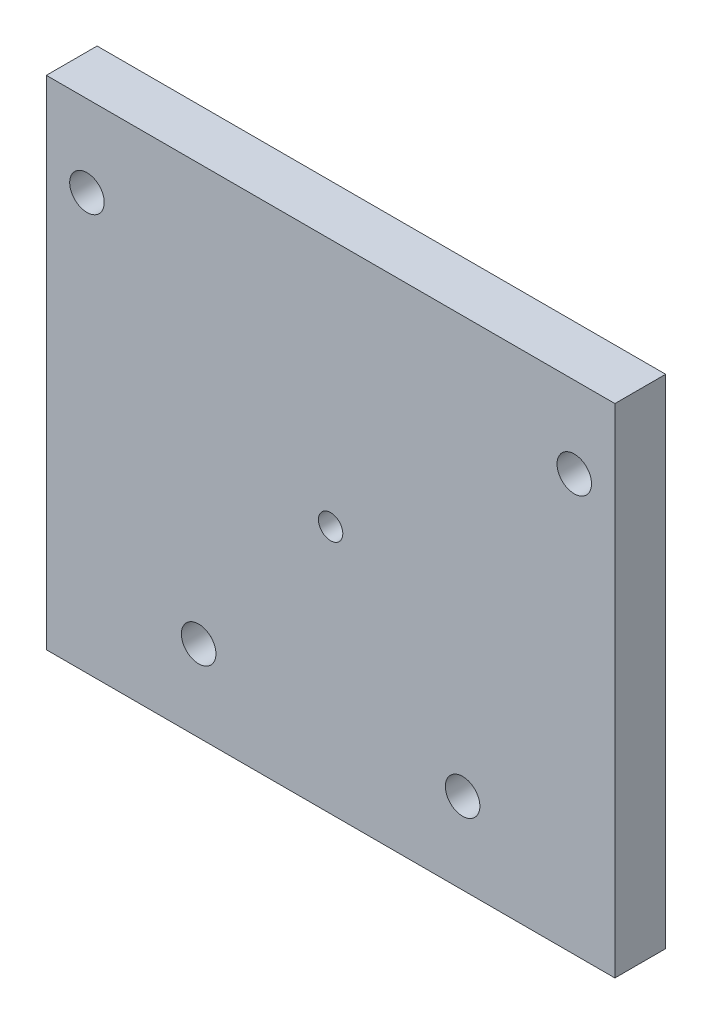
ISO-10303-21;
HEADER;
FILE_DESCRIPTION(('STEP AP214'),'2;1');
FILE_NAME('part.step','',(''),(''),'','','');
FILE_SCHEMA(('AUTOMOTIVE_DESIGN { 1 0 10303 214 1 1 1 1 }'));
ENDSEC;
DATA;
#1=APPLICATION_CONTEXT('core data for automotive mechanical design processes');
#2=APPLICATION_PROTOCOL_DEFINITION('international standard','automotive_design',2000,#1);
#3=PRODUCT_CONTEXT('',#1,'mechanical');
#4=PRODUCT('Part','Part','',(#3));
#5=PRODUCT_RELATED_PRODUCT_CATEGORY('part','',(#4));
#6=PRODUCT_DEFINITION_FORMATION('','',#4);
#7=PRODUCT_DEFINITION_CONTEXT('part definition',#1,'design');
#8=PRODUCT_DEFINITION('design','',#6,#7);
#9=PRODUCT_DEFINITION_SHAPE('','',#8);
#10=(LENGTH_UNIT() NAMED_UNIT(*) SI_UNIT(.MILLI.,.METRE.));
#11=(NAMED_UNIT(*) PLANE_ANGLE_UNIT() SI_UNIT($,.RADIAN.));
#12=(NAMED_UNIT(*) SI_UNIT($,.STERADIAN.) SOLID_ANGLE_UNIT());
#13=UNCERTAINTY_MEASURE_WITH_UNIT(LENGTH_MEASURE(1.E-05),#10,'distance_accuracy_value','');
#14=(GEOMETRIC_REPRESENTATION_CONTEXT(3) GLOBAL_UNCERTAINTY_ASSIGNED_CONTEXT((#13)) GLOBAL_UNIT_ASSIGNED_CONTEXT((#10,
#11,#12)) REPRESENTATION_CONTEXT('',''));
#15=CARTESIAN_POINT('',(0.,0.,0.));
#16=DIRECTION('',(0.,0.,1.));
#17=DIRECTION('',(1.,0.,0.));
#18=AXIS2_PLACEMENT_3D('',#15,#16,#17);
#19=CARTESIAN_POINT('',(-120.,82.5,25.));
#20=DIRECTION('',(0.,0.,-1.));
#21=DIRECTION('',(-1.,0.,0.));
#22=AXIS2_PLACEMENT_3D('',#19,#20,#21);
#23=CYLINDRICAL_SURFACE('',#22,5.24999999999999);
#24=CARTESIAN_POINT('',(-120.,82.5,0.));
#25=DIRECTION('',(0.,0.,1.));
#26=DIRECTION('',(1.,0.,0.));
#27=AXIS2_PLACEMENT_3D('',#24,#25,#26);
#28=CIRCLE('',#27,5.24999999999999);
#29=CARTESIAN_POINT('',(-114.75,82.5,0.));
#30=VERTEX_POINT('',#29);
#31=EDGE_CURVE('E138',#30,#30,#28,.T.);
#32=ORIENTED_EDGE('',*,*,#31,.F.);
#33=EDGE_LOOP('',(#32));
#34=FACE_BOUND('',#33,.T.);
#35=CARTESIAN_POINT('',(-120.,82.5,13.));
#36=DIRECTION('',(0.,0.,1.));
#37=DIRECTION('',(1.,0.,0.));
#38=AXIS2_PLACEMENT_3D('',#35,#36,#37);
#39=CIRCLE('',#38,5.24999999999999);
#40=CARTESIAN_POINT('',(-114.75,82.5,13.));
#41=VERTEX_POINT('',#40);
#42=EDGE_CURVE('E37',#41,#41,#39,.T.);
#43=ORIENTED_EDGE('',*,*,#42,.T.);
#44=EDGE_LOOP('',(#43));
#45=FACE_BOUND('',#44,.T.);
#46=ADVANCED_FACE('F33',(#34,#45),#23,.F.);
#47=CARTESIAN_POINT('',(120.,82.5,25.));
#48=DIRECTION('',(0.,0.,-1.));
#49=DIRECTION('',(-1.,0.,0.));
#50=AXIS2_PLACEMENT_3D('',#47,#48,#49);
#51=CYLINDRICAL_SURFACE('',#50,5.24999999999999);
#52=CARTESIAN_POINT('',(120.,82.5,0.));
#53=DIRECTION('',(0.,0.,1.));
#54=DIRECTION('',(1.,0.,0.));
#55=AXIS2_PLACEMENT_3D('',#52,#53,#54);
#56=CIRCLE('',#55,5.24999999999999);
#57=CARTESIAN_POINT('',(125.25,82.5,0.));
#58=VERTEX_POINT('',#57);
#59=EDGE_CURVE('E130',#58,#58,#56,.T.);
#60=ORIENTED_EDGE('',*,*,#59,.F.);
#61=EDGE_LOOP('',(#60));
#62=FACE_BOUND('',#61,.T.);
#63=CARTESIAN_POINT('',(120.,82.5,13.));
#64=DIRECTION('',(0.,0.,1.));
#65=DIRECTION('',(1.,0.,0.));
#66=AXIS2_PLACEMENT_3D('',#63,#64,#65);
#67=CIRCLE('',#66,5.24999999999999);
#68=CARTESIAN_POINT('',(125.25,82.5,13.));
#69=VERTEX_POINT('',#68);
#70=EDGE_CURVE('E116',#69,#69,#67,.T.);
#71=ORIENTED_EDGE('',*,*,#70,.T.);
#72=EDGE_LOOP('',(#71));
#73=FACE_BOUND('',#72,.T.);
#74=ADVANCED_FACE('F167',(#62,#73),#51,.F.);
#75=CARTESIAN_POINT('',(-65.,-82.5,25.));
#76=DIRECTION('',(0.,0.,-1.));
#77=DIRECTION('',(-1.,0.,0.));
#78=AXIS2_PLACEMENT_3D('',#75,#76,#77);
#79=CYLINDRICAL_SURFACE('',#78,5.25);
#80=CARTESIAN_POINT('',(-65.,-82.5,0.));
#81=DIRECTION('',(0.,0.,1.));
#82=DIRECTION('',(1.,0.,0.));
#83=AXIS2_PLACEMENT_3D('',#80,#81,#82);
#84=CIRCLE('',#83,5.25);
#85=CARTESIAN_POINT('',(-59.75,-82.5,0.));
#86=VERTEX_POINT('',#85);
#87=EDGE_CURVE('E125',#86,#86,#84,.T.);
#88=ORIENTED_EDGE('',*,*,#87,.F.);
#89=EDGE_LOOP('',(#88));
#90=FACE_BOUND('',#89,.T.);
#91=CARTESIAN_POINT('',(-65.,-82.5,13.));
#92=DIRECTION('',(0.,0.,1.));
#93=DIRECTION('',(1.,0.,0.));
#94=AXIS2_PLACEMENT_3D('',#91,#92,#93);
#95=CIRCLE('',#94,5.25);
#96=CARTESIAN_POINT('',(-59.75,-82.5,13.));
#97=VERTEX_POINT('',#96);
#98=EDGE_CURVE('E113',#97,#97,#95,.T.);
#99=ORIENTED_EDGE('',*,*,#98,.T.);
#100=EDGE_LOOP('',(#99));
#101=FACE_BOUND('',#100,.T.);
#102=ADVANCED_FACE('F172',(#90,#101),#79,.F.);
#103=CARTESIAN_POINT('',(65.,-82.5,25.));
#104=DIRECTION('',(0.,0.,-1.));
#105=DIRECTION('',(-1.,0.,0.));
#106=AXIS2_PLACEMENT_3D('',#103,#104,#105);
#107=CYLINDRICAL_SURFACE('',#106,5.25);
#108=CARTESIAN_POINT('',(65.,-82.5,0.));
#109=DIRECTION('',(0.,0.,1.));
#110=DIRECTION('',(1.,0.,0.));
#111=AXIS2_PLACEMENT_3D('',#108,#109,#110);
#112=CIRCLE('',#111,5.25);
#113=CARTESIAN_POINT('',(70.25,-82.5,0.));
#114=VERTEX_POINT('',#113);
#115=EDGE_CURVE('E121',#114,#114,#112,.T.);
#116=ORIENTED_EDGE('',*,*,#115,.F.);
#117=EDGE_LOOP('',(#116));
#118=FACE_BOUND('',#117,.T.);
#119=CARTESIAN_POINT('',(65.,-82.5,13.));
#120=DIRECTION('',(0.,0.,1.));
#121=DIRECTION('',(1.,0.,0.));
#122=AXIS2_PLACEMENT_3D('',#119,#120,#121);
#123=CIRCLE('',#122,5.25);
#124=CARTESIAN_POINT('',(70.25,-82.5,13.));
#125=VERTEX_POINT('',#124);
#126=EDGE_CURVE('E110',#125,#125,#123,.T.);
#127=ORIENTED_EDGE('',*,*,#126,.T.);
#128=EDGE_LOOP('',(#127));
#129=FACE_BOUND('',#128,.T.);
#130=ADVANCED_FACE('F179',(#118,#129),#107,.F.);
#131=CARTESIAN_POINT('',(0.,0.,25.));
#132=DIRECTION('',(0.,0.,-1.));
#133=DIRECTION('',(-1.,0.,0.));
#134=AXIS2_PLACEMENT_3D('',#131,#132,#133);
#135=PLANE('',#134);
#136=CARTESIAN_POINT('',(-120.,82.5,25.));
#137=DIRECTION('',(0.,0.,1.));
#138=DIRECTION('',(1.,0.,0.));
#139=AXIS2_PLACEMENT_3D('',#136,#137,#138);
#140=CIRCLE('',#139,8.49999999999999);
#141=CARTESIAN_POINT('',(-111.5,82.5,25.));
#142=VERTEX_POINT('',#141);
#143=EDGE_CURVE('E215',#142,#142,#140,.T.);
#144=ORIENTED_EDGE('',*,*,#143,.F.);
#145=EDGE_LOOP('',(#144));
#146=FACE_BOUND('',#145,.T.);
#147=CARTESIAN_POINT('',(120.,82.5,25.));
#148=DIRECTION('',(0.,0.,1.));
#149=DIRECTION('',(1.,0.,0.));
#150=AXIS2_PLACEMENT_3D('',#147,#148,#149);
#151=CIRCLE('',#150,8.49999999999999);
#152=CARTESIAN_POINT('',(128.5,82.5,25.));
#153=VERTEX_POINT('',#152);
#154=EDGE_CURVE('E223',#153,#153,#151,.T.);
#155=ORIENTED_EDGE('',*,*,#154,.F.);
#156=EDGE_LOOP('',(#155));
#157=FACE_BOUND('',#156,.T.);
#158=CARTESIAN_POINT('',(65.,-82.5,25.));
#159=DIRECTION('',(0.,0.,1.));
#160=DIRECTION('',(1.,0.,0.));
#161=AXIS2_PLACEMENT_3D('',#158,#159,#160);
#162=CIRCLE('',#161,8.5);
#163=CARTESIAN_POINT('',(73.5,-82.5,25.));
#164=VERTEX_POINT('',#163);
#165=EDGE_CURVE('E229',#164,#164,#162,.T.);
#166=ORIENTED_EDGE('',*,*,#165,.F.);
#167=EDGE_LOOP('',(#166));
#168=FACE_BOUND('',#167,.T.);
#169=CARTESIAN_POINT('',(-65.,-82.5,25.));
#170=DIRECTION('',(0.,0.,1.));
#171=DIRECTION('',(1.,0.,0.));
#172=AXIS2_PLACEMENT_3D('',#169,#170,#171);
#173=CIRCLE('',#172,8.5);
#174=CARTESIAN_POINT('',(-56.5,-82.5,25.));
#175=VERTEX_POINT('',#174);
#176=EDGE_CURVE('E133',#175,#175,#173,.T.);
#177=ORIENTED_EDGE('',*,*,#176,.F.);
#178=EDGE_LOOP('',(#177));
#179=FACE_BOUND('',#178,.T.);
#180=DIRECTION('',(0.,1.,0.));
#181=VECTOR('',#180,1.);
#182=CARTESIAN_POINT('',(140.,-122.5,25.));
#183=LINE('',#182,#181);
#184=CARTESIAN_POINT('',(140.,-122.5,25.));
#185=VERTEX_POINT('',#184);
#186=CARTESIAN_POINT('',(140.,122.5,25.));
#187=VERTEX_POINT('',#186);
#188=EDGE_CURVE('E88',#185,#187,#183,.T.);
#189=ORIENTED_EDGE('',*,*,#188,.T.);
#190=DIRECTION('',(-1.,0.,0.));
#191=VECTOR('',#190,1.);
#192=CARTESIAN_POINT('',(-140.,122.5,25.));
#193=LINE('',#192,#191);
#194=CARTESIAN_POINT('',(-140.,122.5,25.));
#195=VERTEX_POINT('',#194);
#196=EDGE_CURVE('E82',#187,#195,#193,.T.);
#197=ORIENTED_EDGE('',*,*,#196,.T.);
#198=DIRECTION('',(0.,-1.,0.));
#199=VECTOR('',#198,1.);
#200=CARTESIAN_POINT('',(-140.,-122.5,25.));
#201=LINE('',#200,#199);
#202=CARTESIAN_POINT('',(-140.,-122.5,25.));
#203=VERTEX_POINT('',#202);
#204=EDGE_CURVE('E86',#195,#203,#201,.T.);
#205=ORIENTED_EDGE('',*,*,#204,.T.);
#206=DIRECTION('',(1.,0.,0.));
#207=VECTOR('',#206,1.);
#208=CARTESIAN_POINT('',(-140.,-122.5,25.));
#209=LINE('',#208,#207);
#210=EDGE_CURVE('E52',#203,#185,#209,.T.);
#211=ORIENTED_EDGE('',*,*,#210,.T.);
#212=EDGE_LOOP('',(#189,#197,#205,#211));
#213=FACE_BOUND('',#212,.T.);
#214=CARTESIAN_POINT('',(0.,0.,25.));
#215=DIRECTION('',(0.,0.,1.));
#216=DIRECTION('',(1.,0.,0.));
#217=AXIS2_PLACEMENT_3D('',#214,#215,#216);
#218=CIRCLE('',#217,6.);
#219=CARTESIAN_POINT('',(6.,0.,25.));
#220=VERTEX_POINT('',#219);
#221=EDGE_CURVE('E104',#220,#220,#218,.T.);
#222=ORIENTED_EDGE('',*,*,#221,.F.);
#223=EDGE_LOOP('',(#222));
#224=FACE_BOUND('',#223,.T.);
#225=ADVANCED_FACE('F83',(#146,#157,#168,#179,#213,#224),#135,.F.);
#226=CARTESIAN_POINT('',(0.,0.,0.));
#227=DIRECTION('',(0.,0.,-1.));
#228=DIRECTION('',(-1.,0.,0.));
#229=AXIS2_PLACEMENT_3D('',#226,#227,#228);
#230=PLANE('',#229);
#231=ORIENTED_EDGE('',*,*,#87,.T.);
#232=EDGE_LOOP('',(#231));
#233=FACE_BOUND('',#232,.T.);
#234=ORIENTED_EDGE('',*,*,#31,.T.);
#235=EDGE_LOOP('',(#234));
#236=FACE_BOUND('',#235,.T.);
#237=DIRECTION('',(0.,1.,0.));
#238=VECTOR('',#237,1.);
#239=CARTESIAN_POINT('',(140.,-122.5,0.));
#240=LINE('',#239,#238);
#241=CARTESIAN_POINT('',(140.,-122.5,0.));
#242=VERTEX_POINT('',#241);
#243=CARTESIAN_POINT('',(140.,122.5,0.));
#244=VERTEX_POINT('',#243);
#245=EDGE_CURVE('E101',#242,#244,#240,.T.);
#246=ORIENTED_EDGE('',*,*,#245,.F.);
#247=DIRECTION('',(1.,0.,0.));
#248=VECTOR('',#247,1.);
#249=CARTESIAN_POINT('',(-140.,-122.5,0.));
#250=LINE('',#249,#248);
#251=CARTESIAN_POINT('',(-140.,-122.5,0.));
#252=VERTEX_POINT('',#251);
#253=EDGE_CURVE('E75',#252,#242,#250,.T.);
#254=ORIENTED_EDGE('',*,*,#253,.F.);
#255=DIRECTION('',(0.,-1.,0.));
#256=VECTOR('',#255,1.);
#257=CARTESIAN_POINT('',(-140.,-122.5,0.));
#258=LINE('',#257,#256);
#259=CARTESIAN_POINT('',(-140.,122.5,0.));
#260=VERTEX_POINT('',#259);
#261=EDGE_CURVE('E69',#260,#252,#258,.T.);
#262=ORIENTED_EDGE('',*,*,#261,.F.);
#263=DIRECTION('',(-1.,0.,0.));
#264=VECTOR('',#263,1.);
#265=CARTESIAN_POINT('',(-140.,122.5,0.));
#266=LINE('',#265,#264);
#267=EDGE_CURVE('E92',#244,#260,#266,.T.);
#268=ORIENTED_EDGE('',*,*,#267,.F.);
#269=EDGE_LOOP('',(#246,#254,#262,#268));
#270=FACE_BOUND('',#269,.T.);
#271=CARTESIAN_POINT('',(0.,0.,0.));
#272=DIRECTION('',(0.,0.,1.));
#273=DIRECTION('',(1.,0.,0.));
#274=AXIS2_PLACEMENT_3D('',#271,#272,#273);
#275=CIRCLE('',#274,6.);
#276=CARTESIAN_POINT('',(6.,0.,0.));
#277=VERTEX_POINT('',#276);
#278=EDGE_CURVE('E141',#277,#277,#275,.T.);
#279=ORIENTED_EDGE('',*,*,#278,.T.);
#280=EDGE_LOOP('',(#279));
#281=FACE_BOUND('',#280,.T.);
#282=ORIENTED_EDGE('',*,*,#59,.T.);
#283=EDGE_LOOP('',(#282));
#284=FACE_BOUND('',#283,.T.);
#285=ORIENTED_EDGE('',*,*,#115,.T.);
#286=EDGE_LOOP('',(#285));
#287=FACE_BOUND('',#286,.T.);
#288=ADVANCED_FACE('F147',(#233,#236,#270,#281,#284,#287),#230,.T.);
#289=CARTESIAN_POINT('',(140.,-122.5,25.));
#290=DIRECTION('',(-1.,0.,0.));
#291=DIRECTION('',(0.,0.,1.));
#292=AXIS2_PLACEMENT_3D('',#289,#290,#291);
#293=PLANE('',#292);
#294=ORIENTED_EDGE('',*,*,#245,.T.);
#295=DIRECTION('',(0.,0.,-1.));
#296=VECTOR('',#295,1.);
#297=CARTESIAN_POINT('',(140.,122.5,25.));
#298=LINE('',#297,#296);
#299=EDGE_CURVE('E11',#187,#244,#298,.T.);
#300=ORIENTED_EDGE('',*,*,#299,.F.);
#301=ORIENTED_EDGE('',*,*,#188,.F.);
#302=DIRECTION('',(0.,0.,-1.));
#303=VECTOR('',#302,1.);
#304=CARTESIAN_POINT('',(140.,-122.5,25.));
#305=LINE('',#304,#303);
#306=EDGE_CURVE('E97',#185,#242,#305,.T.);
#307=ORIENTED_EDGE('',*,*,#306,.T.);
#308=EDGE_LOOP('',(#294,#300,#301,#307));
#309=FACE_BOUND('',#308,.T.);
#310=ADVANCED_FACE('F35',(#309),#293,.F.);
#311=CARTESIAN_POINT('',(-140.,122.5,25.));
#312=DIRECTION('',(0.,-1.,0.));
#313=DIRECTION('',(0.,0.,-1.));
#314=AXIS2_PLACEMENT_3D('',#311,#312,#313);
#315=PLANE('',#314);
#316=ORIENTED_EDGE('',*,*,#267,.T.);
#317=DIRECTION('',(0.,0.,-1.));
#318=VECTOR('',#317,1.);
#319=CARTESIAN_POINT('',(-140.,122.5,25.));
#320=LINE('',#319,#318);
#321=EDGE_CURVE('E43',#195,#260,#320,.T.);
#322=ORIENTED_EDGE('',*,*,#321,.F.);
#323=ORIENTED_EDGE('',*,*,#196,.F.);
#324=ORIENTED_EDGE('',*,*,#299,.T.);
#325=EDGE_LOOP('',(#316,#322,#323,#324));
#326=FACE_BOUND('',#325,.T.);
#327=ADVANCED_FACE('F91',(#326),#315,.F.);
#328=CARTESIAN_POINT('',(-140.,-122.5,25.));
#329=DIRECTION('',(1.,0.,0.));
#330=DIRECTION('',(0.,0.,-1.));
#331=AXIS2_PLACEMENT_3D('',#328,#329,#330);
#332=PLANE('',#331);
#333=ORIENTED_EDGE('',*,*,#261,.T.);
#334=DIRECTION('',(0.,0.,-1.));
#335=VECTOR('',#334,1.);
#336=CARTESIAN_POINT('',(-140.,-122.5,25.));
#337=LINE('',#336,#335);
#338=EDGE_CURVE('E93',#203,#252,#337,.T.);
#339=ORIENTED_EDGE('',*,*,#338,.F.);
#340=ORIENTED_EDGE('',*,*,#204,.F.);
#341=ORIENTED_EDGE('',*,*,#321,.T.);
#342=EDGE_LOOP('',(#333,#339,#340,#341));
#343=FACE_BOUND('',#342,.T.);
#344=ADVANCED_FACE('F95',(#343),#332,.F.);
#345=CARTESIAN_POINT('',(-140.,-122.5,25.));
#346=DIRECTION('',(0.,1.,0.));
#347=DIRECTION('',(0.,0.,1.));
#348=AXIS2_PLACEMENT_3D('',#345,#346,#347);
#349=PLANE('',#348);
#350=ORIENTED_EDGE('',*,*,#253,.T.);
#351=ORIENTED_EDGE('',*,*,#306,.F.);
#352=ORIENTED_EDGE('',*,*,#210,.F.);
#353=ORIENTED_EDGE('',*,*,#338,.T.);
#354=EDGE_LOOP('',(#350,#351,#352,#353));
#355=FACE_BOUND('',#354,.T.);
#356=ADVANCED_FACE('F153',(#355),#349,.F.);
#357=CARTESIAN_POINT('',(0.,0.,25.));
#358=DIRECTION('',(0.,0.,-1.));
#359=DIRECTION('',(-1.,0.,0.));
#360=AXIS2_PLACEMENT_3D('',#357,#358,#359);
#361=CYLINDRICAL_SURFACE('',#360,6.);
#362=ORIENTED_EDGE('',*,*,#221,.T.);
#363=EDGE_LOOP('',(#362));
#364=FACE_BOUND('',#363,.T.);
#365=ORIENTED_EDGE('',*,*,#278,.F.);
#366=EDGE_LOOP('',(#365));
#367=FACE_BOUND('',#366,.T.);
#368=ADVANCED_FACE('F150',(#364,#367),#361,.F.);
#369=CARTESIAN_POINT('',(65.,-82.5,13.));
#370=DIRECTION('',(0.,0.,1.));
#371=DIRECTION('',(1.,0.,0.));
#372=AXIS2_PLACEMENT_3D('',#369,#370,#371);
#373=CYLINDRICAL_SURFACE('',#372,8.5);
#374=CARTESIAN_POINT('',(65.,-82.5,13.));
#375=DIRECTION('',(0.,0.,1.));
#376=DIRECTION('',(1.,0.,0.));
#377=AXIS2_PLACEMENT_3D('',#374,#375,#376);
#378=CIRCLE('',#377,8.5);
#379=CARTESIAN_POINT('',(73.5,-82.5,13.));
#380=VERTEX_POINT('',#379);
#381=EDGE_CURVE('E226',#380,#380,#378,.T.);
#382=ORIENTED_EDGE('',*,*,#381,.F.);
#383=EDGE_LOOP('',(#382));
#384=FACE_BOUND('',#383,.T.);
#385=ORIENTED_EDGE('',*,*,#165,.T.);
#386=EDGE_LOOP('',(#385));
#387=FACE_BOUND('',#386,.T.);
#388=ADVANCED_FACE('F152',(#384,#387),#373,.F.);
#389=CARTESIAN_POINT('',(65.,-82.5,13.));
#390=DIRECTION('',(0.,0.,1.));
#391=DIRECTION('',(1.,0.,0.));
#392=AXIS2_PLACEMENT_3D('',#389,#390,#391);
#393=PLANE('',#392);
#394=ORIENTED_EDGE('',*,*,#126,.F.);
#395=EDGE_LOOP('',(#394));
#396=FACE_BOUND('',#395,.T.);
#397=ORIENTED_EDGE('',*,*,#381,.T.);
#398=EDGE_LOOP('',(#397));
#399=FACE_BOUND('',#398,.T.);
#400=ADVANCED_FACE('F160',(#396,#399),#393,.T.);
#401=CARTESIAN_POINT('',(-65.,-82.5,13.));
#402=DIRECTION('',(0.,0.,1.));
#403=DIRECTION('',(1.,0.,0.));
#404=AXIS2_PLACEMENT_3D('',#401,#402,#403);
#405=CYLINDRICAL_SURFACE('',#404,8.5);
#406=CARTESIAN_POINT('',(-65.,-82.5,13.));
#407=DIRECTION('',(0.,0.,1.));
#408=DIRECTION('',(1.,0.,0.));
#409=AXIS2_PLACEMENT_3D('',#406,#407,#408);
#410=CIRCLE('',#409,8.5);
#411=CARTESIAN_POINT('',(-56.5,-82.5,13.));
#412=VERTEX_POINT('',#411);
#413=EDGE_CURVE('E231',#412,#412,#410,.T.);
#414=ORIENTED_EDGE('',*,*,#413,.F.);
#415=EDGE_LOOP('',(#414));
#416=FACE_BOUND('',#415,.T.);
#417=ORIENTED_EDGE('',*,*,#176,.T.);
#418=EDGE_LOOP('',(#417));
#419=FACE_BOUND('',#418,.T.);
#420=ADVANCED_FACE('F184',(#416,#419),#405,.F.);
#421=CARTESIAN_POINT('',(-65.,-82.5,13.));
#422=DIRECTION('',(0.,0.,1.));
#423=DIRECTION('',(1.,0.,0.));
#424=AXIS2_PLACEMENT_3D('',#421,#422,#423);
#425=PLANE('',#424);
#426=ORIENTED_EDGE('',*,*,#98,.F.);
#427=EDGE_LOOP('',(#426));
#428=FACE_BOUND('',#427,.T.);
#429=ORIENTED_EDGE('',*,*,#413,.T.);
#430=EDGE_LOOP('',(#429));
#431=FACE_BOUND('',#430,.T.);
#432=ADVANCED_FACE('F187',(#428,#431),#425,.T.);
#433=CARTESIAN_POINT('',(120.,82.5,13.));
#434=DIRECTION('',(0.,0.,1.));
#435=DIRECTION('',(1.,0.,0.));
#436=AXIS2_PLACEMENT_3D('',#433,#434,#435);
#437=CYLINDRICAL_SURFACE('',#436,8.49999999999999);
#438=CARTESIAN_POINT('',(120.,82.5,13.));
#439=DIRECTION('',(0.,0.,1.));
#440=DIRECTION('',(1.,0.,0.));
#441=AXIS2_PLACEMENT_3D('',#438,#439,#440);
#442=CIRCLE('',#441,8.49999999999999);
#443=CARTESIAN_POINT('',(128.5,82.5,13.));
#444=VERTEX_POINT('',#443);
#445=EDGE_CURVE('E218',#444,#444,#442,.T.);
#446=ORIENTED_EDGE('',*,*,#445,.F.);
#447=EDGE_LOOP('',(#446));
#448=FACE_BOUND('',#447,.T.);
#449=ORIENTED_EDGE('',*,*,#154,.T.);
#450=EDGE_LOOP('',(#449));
#451=FACE_BOUND('',#450,.T.);
#452=ADVANCED_FACE('F190',(#448,#451),#437,.F.);
#453=CARTESIAN_POINT('',(120.,82.5,13.));
#454=DIRECTION('',(0.,0.,1.));
#455=DIRECTION('',(1.,0.,0.));
#456=AXIS2_PLACEMENT_3D('',#453,#454,#455);
#457=PLANE('',#456);
#458=ORIENTED_EDGE('',*,*,#70,.F.);
#459=EDGE_LOOP('',(#458));
#460=FACE_BOUND('',#459,.T.);
#461=ORIENTED_EDGE('',*,*,#445,.T.);
#462=EDGE_LOOP('',(#461));
#463=FACE_BOUND('',#462,.T.);
#464=ADVANCED_FACE('F198',(#460,#463),#457,.T.);
#465=CARTESIAN_POINT('',(-120.,82.5,13.));
#466=DIRECTION('',(0.,0.,1.));
#467=DIRECTION('',(1.,0.,0.));
#468=AXIS2_PLACEMENT_3D('',#465,#466,#467);
#469=CYLINDRICAL_SURFACE('',#468,8.49999999999999);
#470=CARTESIAN_POINT('',(-120.,82.5,13.));
#471=DIRECTION('',(0.,0.,1.));
#472=DIRECTION('',(1.,0.,0.));
#473=AXIS2_PLACEMENT_3D('',#470,#471,#472);
#474=CIRCLE('',#473,8.49999999999999);
#475=CARTESIAN_POINT('',(-111.5,82.5,13.));
#476=VERTEX_POINT('',#475);
#477=EDGE_CURVE('E114',#476,#476,#474,.T.);
#478=ORIENTED_EDGE('',*,*,#477,.F.);
#479=EDGE_LOOP('',(#478));
#480=FACE_BOUND('',#479,.T.);
#481=ORIENTED_EDGE('',*,*,#143,.T.);
#482=EDGE_LOOP('',(#481));
#483=FACE_BOUND('',#482,.T.);
#484=ADVANCED_FACE('F202',(#480,#483),#469,.F.);
#485=CARTESIAN_POINT('',(-120.,82.5,13.));
#486=DIRECTION('',(0.,0.,1.));
#487=DIRECTION('',(1.,0.,0.));
#488=AXIS2_PLACEMENT_3D('',#485,#486,#487);
#489=PLANE('',#488);
#490=ORIENTED_EDGE('',*,*,#42,.F.);
#491=EDGE_LOOP('',(#490));
#492=FACE_BOUND('',#491,.T.);
#493=ORIENTED_EDGE('',*,*,#477,.T.);
#494=EDGE_LOOP('',(#493));
#495=FACE_BOUND('',#494,.T.);
#496=ADVANCED_FACE('F206',(#492,#495),#489,.T.);
#497=CLOSED_SHELL('',(#46,#74,#102,#130,#225,#288,#310,#327,#344,#356,#368,#388,#400,#420,#432,
#452,#464,#484,#496));
#498=MANIFOLD_SOLID_BREP('B2',#497);
#499=ADVANCED_BREP_SHAPE_REPRESENTATION('',(#18,#498),#14);
#500=SHAPE_DEFINITION_REPRESENTATION(#9,#499);
ENDSEC;
END-ISO-10303-21;
